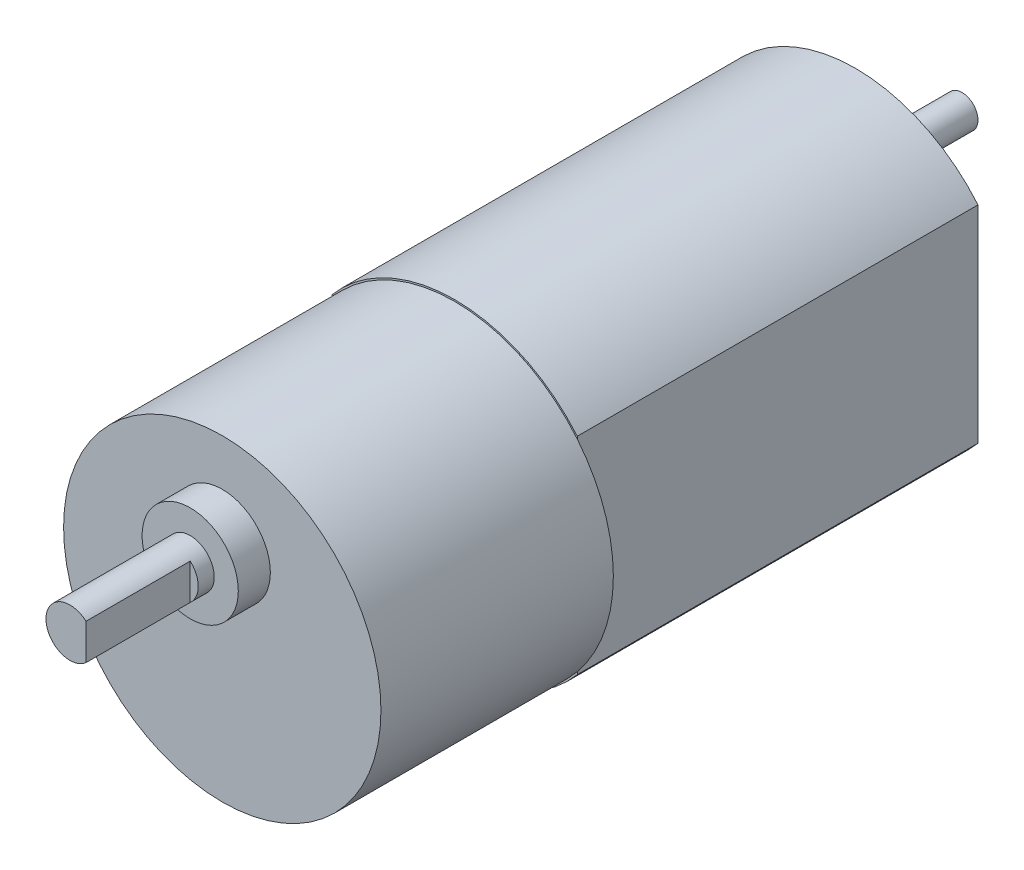
ISO-10303-21;
HEADER;
FILE_DESCRIPTION(('STEP AP214'),'2;1');
FILE_NAME('part.step','',(''),(''),'','','');
FILE_SCHEMA(('AUTOMOTIVE_DESIGN { 1 0 10303 214 1 1 1 1 }'));
ENDSEC;
DATA;
#1=APPLICATION_CONTEXT('core data for automotive mechanical design processes');
#2=APPLICATION_PROTOCOL_DEFINITION('international standard','automotive_design',2000,#1);
#3=PRODUCT_CONTEXT('',#1,'mechanical');
#4=PRODUCT('Part','Part','',(#3));
#5=PRODUCT_RELATED_PRODUCT_CATEGORY('part','',(#4));
#6=PRODUCT_DEFINITION_FORMATION('','',#4);
#7=PRODUCT_DEFINITION_CONTEXT('part definition',#1,'design');
#8=PRODUCT_DEFINITION('design','',#6,#7);
#9=PRODUCT_DEFINITION_SHAPE('','',#8);
#10=(LENGTH_UNIT() NAMED_UNIT(*) SI_UNIT(.MILLI.,.METRE.));
#11=(NAMED_UNIT(*) PLANE_ANGLE_UNIT() SI_UNIT($,.RADIAN.));
#12=(NAMED_UNIT(*) SI_UNIT($,.STERADIAN.) SOLID_ANGLE_UNIT());
#13=UNCERTAINTY_MEASURE_WITH_UNIT(LENGTH_MEASURE(1.E-05),#10,'distance_accuracy_value','');
#14=(GEOMETRIC_REPRESENTATION_CONTEXT(3) GLOBAL_UNCERTAINTY_ASSIGNED_CONTEXT((#13)) GLOBAL_UNIT_ASSIGNED_CONTEXT((#10,
#11,#12)) REPRESENTATION_CONTEXT('',''));
#15=CARTESIAN_POINT('',(0.,0.,0.));
#16=DIRECTION('',(0.,0.,1.));
#17=DIRECTION('',(1.,0.,0.));
#18=AXIS2_PLACEMENT_3D('',#15,#16,#17);
#19=CARTESIAN_POINT('',(0.,4.,41.5));
#20=DIRECTION('',(0.,0.,1.));
#21=DIRECTION('',(1.,0.,0.));
#22=AXIS2_PLACEMENT_3D('',#19,#20,#21);
#23=PLANE('',#22);
#24=CARTESIAN_POINT('',(0.,4.,41.5));
#25=DIRECTION('',(0.,0.,1.));
#26=DIRECTION('',(1.,0.,0.));
#27=AXIS2_PLACEMENT_3D('',#24,#25,#26);
#28=CIRCLE('',#27,3.);
#29=CARTESIAN_POINT('',(3.,4.,41.5));
#30=VERTEX_POINT('',#29);
#31=EDGE_CURVE('E126',#30,#30,#28,.T.);
#32=ORIENTED_EDGE('',*,*,#31,.T.);
#33=EDGE_LOOP('',(#32));
#34=FACE_BOUND('',#33,.T.);
#35=CARTESIAN_POINT('',(0.,4.,41.5));
#36=DIRECTION('',(0.,0.,1.));
#37=DIRECTION('',(1.,0.,0.));
#38=AXIS2_PLACEMENT_3D('',#35,#36,#37);
#39=CIRCLE('',#38,1.5);
#40=CARTESIAN_POINT('',(1.5,4.,41.5));
#41=VERTEX_POINT('',#40);
#42=EDGE_CURVE('E118',#41,#41,#39,.T.);
#43=ORIENTED_EDGE('',*,*,#42,.F.);
#44=EDGE_LOOP('',(#43));
#45=FACE_BOUND('',#44,.T.);
#46=ADVANCED_FACE('F38',(#34,#45),#23,.T.);
#47=CARTESIAN_POINT('',(0.,0.,39.5));
#48=DIRECTION('',(0.,0.,1.));
#49=DIRECTION('',(1.,0.,0.));
#50=AXIS2_PLACEMENT_3D('',#47,#48,#49);
#51=PLANE('',#50);
#52=CARTESIAN_POINT('',(0.,0.,39.5));
#53=DIRECTION('',(0.,0.,1.));
#54=DIRECTION('',(1.,0.,0.));
#55=AXIS2_PLACEMENT_3D('',#52,#53,#54);
#56=CIRCLE('',#55,9.9);
#57=CARTESIAN_POINT('',(9.9,0.,39.5));
#58=VERTEX_POINT('',#57);
#59=EDGE_CURVE('E147',#58,#58,#56,.T.);
#60=ORIENTED_EDGE('',*,*,#59,.T.);
#61=EDGE_LOOP('',(#60));
#62=FACE_BOUND('',#61,.T.);
#63=CARTESIAN_POINT('',(0.,4.,39.5));
#64=DIRECTION('',(0.,0.,1.));
#65=DIRECTION('',(1.,0.,0.));
#66=AXIS2_PLACEMENT_3D('',#63,#64,#65);
#67=CIRCLE('',#66,3.);
#68=CARTESIAN_POINT('',(3.,4.,39.5));
#69=VERTEX_POINT('',#68);
#70=EDGE_CURVE('E124',#69,#69,#67,.T.);
#71=ORIENTED_EDGE('',*,*,#70,.F.);
#72=EDGE_LOOP('',(#71));
#73=FACE_BOUND('',#72,.T.);
#74=ADVANCED_FACE('F200',(#62,#73),#51,.T.);
#75=CARTESIAN_POINT('',(0.,0.,0.));
#76=DIRECTION('',(0.,0.,1.));
#77=DIRECTION('',(1.,0.,0.));
#78=AXIS2_PLACEMENT_3D('',#75,#76,#77);
#79=PLANE('',#78);
#80=CARTESIAN_POINT('',(2.65,7.01623118205208,0.));
#81=DIRECTION('',(0.,0.,1.));
#82=DIRECTION('',(1.,0.,0.));
#83=AXIS2_PLACEMENT_3D('',#80,#81,#82);
#84=CIRCLE('',#83,1.);
#85=CARTESIAN_POINT('',(3.65,7.01623118205208,0.));
#86=VERTEX_POINT('',#85);
#87=EDGE_CURVE('E190',#86,#86,#84,.F.);
#88=ORIENTED_EDGE('',*,*,#87,.F.);
#89=EDGE_LOOP('',(#88));
#90=FACE_BOUND('',#89,.T.);
#91=CARTESIAN_POINT('',(0.,0.,0.));
#92=DIRECTION('',(0.,0.,1.));
#93=DIRECTION('',(1.,0.,0.));
#94=AXIS2_PLACEMENT_3D('',#91,#92,#93);
#95=CIRCLE('',#94,10.);
#96=CARTESIAN_POINT('',(7.65,6.440302787913,0.));
#97=VERTEX_POINT('',#96);
#98=CARTESIAN_POINT('',(-7.65,6.440302787913,0.));
#99=VERTEX_POINT('',#98);
#100=EDGE_CURVE('E150',#97,#99,#95,.T.);
#101=ORIENTED_EDGE('',*,*,#100,.F.);
#102=DIRECTION('',(0.,1.,0.));
#103=VECTOR('',#102,1.);
#104=CARTESIAN_POINT('',(7.65,-6.440302787913,0.));
#105=LINE('',#104,#103);
#106=CARTESIAN_POINT('',(7.65,-6.440302787913,0.));
#107=VERTEX_POINT('',#106);
#108=EDGE_CURVE('E158',#107,#97,#105,.T.);
#109=ORIENTED_EDGE('',*,*,#108,.F.);
#110=CARTESIAN_POINT('',(0.,0.,0.));
#111=DIRECTION('',(0.,0.,1.));
#112=DIRECTION('',(1.,0.,0.));
#113=AXIS2_PLACEMENT_3D('',#110,#111,#112);
#114=CIRCLE('',#113,10.);
#115=CARTESIAN_POINT('',(-7.65,-6.440302787913,0.));
#116=VERTEX_POINT('',#115);
#117=EDGE_CURVE('E173',#116,#107,#114,.T.);
#118=ORIENTED_EDGE('',*,*,#117,.F.);
#119=DIRECTION('',(0.,-1.,0.));
#120=VECTOR('',#119,1.);
#121=CARTESIAN_POINT('',(-7.65,6.440302787913,0.));
#122=LINE('',#121,#120);
#123=EDGE_CURVE('E171',#99,#116,#122,.T.);
#124=ORIENTED_EDGE('',*,*,#123,.F.);
#125=EDGE_LOOP('',(#101,#109,#118,#124));
#126=FACE_BOUND('',#125,.T.);
#127=CARTESIAN_POINT('',(0.,0.,0.));
#128=DIRECTION('',(0.,0.,1.));
#129=DIRECTION('',(1.,0.,0.));
#130=AXIS2_PLACEMENT_3D('',#127,#128,#129);
#131=CIRCLE('',#130,3.);
#132=CARTESIAN_POINT('',(3.,0.,0.));
#133=VERTEX_POINT('',#132);
#134=EDGE_CURVE('E187',#133,#133,#131,.F.);
#135=ORIENTED_EDGE('',*,*,#134,.F.);
#136=EDGE_LOOP('',(#135));
#137=FACE_BOUND('',#136,.T.);
#138=CARTESIAN_POINT('',(-2.65,-7.01623118205208,0.));
#139=DIRECTION('',(0.,0.,1.));
#140=DIRECTION('',(1.,0.,0.));
#141=AXIS2_PLACEMENT_3D('',#138,#139,#140);
#142=CIRCLE('',#141,1.);
#143=CARTESIAN_POINT('',(-1.65,-7.01623118205208,0.));
#144=VERTEX_POINT('',#143);
#145=EDGE_CURVE('E46',#144,#144,#142,.F.);
#146=ORIENTED_EDGE('',*,*,#145,.F.);
#147=EDGE_LOOP('',(#146));
#148=FACE_BOUND('',#147,.T.);
#149=ADVANCED_FACE('F197',(#90,#126,#137,#148),#79,.F.);
#150=CARTESIAN_POINT('',(0.,0.,-2.5));
#151=DIRECTION('',(0.,0.,-1.));
#152=DIRECTION('',(-1.,0.,0.));
#153=AXIS2_PLACEMENT_3D('',#150,#151,#152);
#154=PLANE('',#153);
#155=CARTESIAN_POINT('',(0.,0.,-2.5));
#156=DIRECTION('',(0.,0.,-1.));
#157=DIRECTION('',(-1.,0.,0.));
#158=AXIS2_PLACEMENT_3D('',#155,#156,#157);
#159=CIRCLE('',#158,3.);
#160=CARTESIAN_POINT('',(-3.,0.,-2.5));
#161=VERTEX_POINT('',#160);
#162=EDGE_CURVE('E141',#161,#161,#159,.T.);
#163=ORIENTED_EDGE('',*,*,#162,.T.);
#164=EDGE_LOOP('',(#163));
#165=FACE_BOUND('',#164,.T.);
#166=CARTESIAN_POINT('',(0.,0.,-2.5));
#167=DIRECTION('',(0.,0.,-1.));
#168=DIRECTION('',(-1.,0.,0.));
#169=AXIS2_PLACEMENT_3D('',#166,#167,#168);
#170=CIRCLE('',#169,1.);
#171=CARTESIAN_POINT('',(-1.,0.,-2.5));
#172=VERTEX_POINT('',#171);
#173=EDGE_CURVE('E137',#172,#172,#170,.T.);
#174=ORIENTED_EDGE('',*,*,#173,.F.);
#175=EDGE_LOOP('',(#174));
#176=FACE_BOUND('',#175,.T.);
#177=ADVANCED_FACE('F199',(#165,#176),#154,.T.);
#178=CARTESIAN_POINT('',(0.,0.,25.));
#179=DIRECTION('',(0.,0.,1.));
#180=DIRECTION('',(1.,0.,0.));
#181=AXIS2_PLACEMENT_3D('',#178,#179,#180);
#182=PLANE('',#181);
#183=CARTESIAN_POINT('',(0.,0.,25.));
#184=DIRECTION('',(0.,0.,1.));
#185=DIRECTION('',(1.,0.,0.));
#186=AXIS2_PLACEMENT_3D('',#183,#184,#185);
#187=CIRCLE('',#186,9.9);
#188=CARTESIAN_POINT('',(7.65,6.28390801969602,25.));
#189=VERTEX_POINT('',#188);
#190=CARTESIAN_POINT('',(-7.65,6.28390801969602,25.));
#191=VERTEX_POINT('',#190);
#192=EDGE_CURVE('E61',#189,#191,#187,.T.);
#193=ORIENTED_EDGE('',*,*,#192,.F.);
#194=DIRECTION('',(0.,1.,0.));
#195=VECTOR('',#194,1.);
#196=CARTESIAN_POINT('',(7.65,-6.440302787913,25.));
#197=LINE('',#196,#195);
#198=CARTESIAN_POINT('',(7.65,6.440302787913,25.));
#199=VERTEX_POINT('',#198);
#200=EDGE_CURVE('E164',#189,#199,#197,.T.);
#201=ORIENTED_EDGE('',*,*,#200,.T.);
#202=CARTESIAN_POINT('',(0.,0.,25.));
#203=DIRECTION('',(0.,0.,1.));
#204=DIRECTION('',(1.,0.,0.));
#205=AXIS2_PLACEMENT_3D('',#202,#203,#204);
#206=CIRCLE('',#205,10.);
#207=CARTESIAN_POINT('',(-7.65,6.440302787913,25.));
#208=VERTEX_POINT('',#207);
#209=EDGE_CURVE('E154',#199,#208,#206,.T.);
#210=ORIENTED_EDGE('',*,*,#209,.T.);
#211=DIRECTION('',(0.,-1.,0.));
#212=VECTOR('',#211,1.);
#213=CARTESIAN_POINT('',(-7.65,6.440302787913,25.));
#214=LINE('',#213,#212);
#215=EDGE_CURVE('E159',#208,#191,#214,.T.);
#216=ORIENTED_EDGE('',*,*,#215,.T.);
#217=EDGE_LOOP('',(#193,#201,#210,#216));
#218=FACE_BOUND('',#217,.T.);
#219=ADVANCED_FACE('F207',(#218),#182,.T.);
#220=CARTESIAN_POINT('',(0.,0.,25.));
#221=DIRECTION('',(0.,0.,-1.));
#222=DIRECTION('',(-1.,0.,0.));
#223=AXIS2_PLACEMENT_3D('',#220,#221,#222);
#224=CYLINDRICAL_SURFACE('',#223,10.);
#225=ORIENTED_EDGE('',*,*,#100,.T.);
#226=DIRECTION('',(0.,0.,-1.));
#227=VECTOR('',#226,1.);
#228=CARTESIAN_POINT('',(-7.65,6.440302787913,25.));
#229=LINE('',#228,#227);
#230=EDGE_CURVE('E184',#208,#99,#229,.T.);
#231=ORIENTED_EDGE('',*,*,#230,.F.);
#232=ORIENTED_EDGE('',*,*,#209,.F.);
#233=DIRECTION('',(0.,0.,-1.));
#234=VECTOR('',#233,1.);
#235=CARTESIAN_POINT('',(7.65,6.440302787913,25.));
#236=LINE('',#235,#234);
#237=EDGE_CURVE('E167',#199,#97,#236,.T.);
#238=ORIENTED_EDGE('',*,*,#237,.T.);
#239=EDGE_LOOP('',(#225,#231,#232,#238));
#240=FACE_BOUND('',#239,.T.);
#241=ADVANCED_FACE('F40',(#240),#224,.T.);
#242=CARTESIAN_POINT('',(-7.65,6.440302787913,25.));
#243=DIRECTION('',(1.,0.,0.));
#244=DIRECTION('',(0.,0.,-1.));
#245=AXIS2_PLACEMENT_3D('',#242,#243,#244);
#246=PLANE('',#245);
#247=ORIENTED_EDGE('',*,*,#123,.T.);
#248=DIRECTION('',(0.,0.,-1.));
#249=VECTOR('',#248,1.);
#250=CARTESIAN_POINT('',(-7.65,-6.440302787913,25.));
#251=LINE('',#250,#249);
#252=CARTESIAN_POINT('',(-7.65,-6.440302787913,25.));
#253=VERTEX_POINT('',#252);
#254=EDGE_CURVE('E181',#253,#116,#251,.T.);
#255=ORIENTED_EDGE('',*,*,#254,.F.);
#256=CARTESIAN_POINT('',(-7.65,-6.28390801969602,25.));
#257=VERTEX_POINT('',#256);
#258=EDGE_CURVE('E157',#257,#253,#214,.T.);
#259=ORIENTED_EDGE('',*,*,#258,.F.);
#260=EDGE_CURVE('E162',#191,#257,#214,.T.);
#261=ORIENTED_EDGE('',*,*,#260,.F.);
#262=ORIENTED_EDGE('',*,*,#215,.F.);
#263=ORIENTED_EDGE('',*,*,#230,.T.);
#264=EDGE_LOOP('',(#247,#255,#259,#261,#262,#263));
#265=FACE_BOUND('',#264,.T.);
#266=ADVANCED_FACE('F277',(#265),#246,.F.);
#267=CARTESIAN_POINT('',(0.,0.,25.));
#268=DIRECTION('',(0.,0.,-1.));
#269=DIRECTION('',(-1.,0.,0.));
#270=AXIS2_PLACEMENT_3D('',#267,#268,#269);
#271=CYLINDRICAL_SURFACE('',#270,10.);
#272=ORIENTED_EDGE('',*,*,#117,.T.);
#273=DIRECTION('',(0.,0.,-1.));
#274=VECTOR('',#273,1.);
#275=CARTESIAN_POINT('',(7.65,-6.440302787913,25.));
#276=LINE('',#275,#274);
#277=CARTESIAN_POINT('',(7.65,-6.440302787913,25.));
#278=VERTEX_POINT('',#277);
#279=EDGE_CURVE('E178',#278,#107,#276,.T.);
#280=ORIENTED_EDGE('',*,*,#279,.F.);
#281=CARTESIAN_POINT('',(0.,0.,25.));
#282=DIRECTION('',(0.,0.,1.));
#283=DIRECTION('',(1.,0.,0.));
#284=AXIS2_PLACEMENT_3D('',#281,#282,#283);
#285=CIRCLE('',#284,10.);
#286=EDGE_CURVE('E161',#253,#278,#285,.T.);
#287=ORIENTED_EDGE('',*,*,#286,.F.);
#288=ORIENTED_EDGE('',*,*,#254,.T.);
#289=EDGE_LOOP('',(#272,#280,#287,#288));
#290=FACE_BOUND('',#289,.T.);
#291=ADVANCED_FACE('F271',(#290),#271,.T.);
#292=CARTESIAN_POINT('',(7.65,-6.440302787913,25.));
#293=DIRECTION('',(-1.,0.,0.));
#294=DIRECTION('',(0.,0.,1.));
#295=AXIS2_PLACEMENT_3D('',#292,#293,#294);
#296=PLANE('',#295);
#297=ORIENTED_EDGE('',*,*,#108,.T.);
#298=ORIENTED_EDGE('',*,*,#237,.F.);
#299=ORIENTED_EDGE('',*,*,#200,.F.);
#300=CARTESIAN_POINT('',(7.65,-6.28390801969602,25.));
#301=VERTEX_POINT('',#300);
#302=EDGE_CURVE('E168',#301,#189,#197,.T.);
#303=ORIENTED_EDGE('',*,*,#302,.F.);
#304=EDGE_CURVE('E165',#278,#301,#197,.T.);
#305=ORIENTED_EDGE('',*,*,#304,.F.);
#306=ORIENTED_EDGE('',*,*,#279,.T.);
#307=EDGE_LOOP('',(#297,#298,#299,#303,#305,#306));
#308=FACE_BOUND('',#307,.T.);
#309=ADVANCED_FACE('F266',(#308),#296,.F.);
#310=EDGE_CURVE('E153',#257,#301,#187,.T.);
#311=ORIENTED_EDGE('',*,*,#310,.F.);
#312=ORIENTED_EDGE('',*,*,#258,.T.);
#313=ORIENTED_EDGE('',*,*,#286,.T.);
#314=ORIENTED_EDGE('',*,*,#304,.T.);
#315=EDGE_LOOP('',(#311,#312,#313,#314));
#316=FACE_BOUND('',#315,.T.);
#317=ADVANCED_FACE('F261',(#316),#182,.T.);
#318=CARTESIAN_POINT('',(0.,0.,25.));
#319=DIRECTION('',(0.,0.,1.));
#320=DIRECTION('',(1.,0.,0.));
#321=AXIS2_PLACEMENT_3D('',#318,#319,#320);
#322=PLANE('',#321);
#323=EDGE_CURVE('E152',#191,#257,#187,.T.);
#324=ORIENTED_EDGE('',*,*,#323,.F.);
#325=ORIENTED_EDGE('',*,*,#260,.T.);
#326=EDGE_LOOP('',(#324,#325));
#327=FACE_BOUND('',#326,.T.);
#328=ADVANCED_FACE('F257',(#327),#322,.F.);
#329=EDGE_CURVE('E146',#301,#189,#187,.T.);
#330=ORIENTED_EDGE('',*,*,#329,.F.);
#331=ORIENTED_EDGE('',*,*,#302,.T.);
#332=EDGE_LOOP('',(#330,#331));
#333=FACE_BOUND('',#332,.T.);
#334=ADVANCED_FACE('F260',(#333),#322,.F.);
#335=CARTESIAN_POINT('',(0.,0.,39.5));
#336=DIRECTION('',(0.,0.,-1.));
#337=DIRECTION('',(-1.,0.,0.));
#338=AXIS2_PLACEMENT_3D('',#335,#336,#337);
#339=CYLINDRICAL_SURFACE('',#338,9.9);
#340=ORIENTED_EDGE('',*,*,#59,.F.);
#341=EDGE_LOOP('',(#340));
#342=FACE_BOUND('',#341,.T.);
#343=ORIENTED_EDGE('',*,*,#192,.T.);
#344=ORIENTED_EDGE('',*,*,#323,.T.);
#345=ORIENTED_EDGE('',*,*,#310,.T.);
#346=ORIENTED_EDGE('',*,*,#329,.T.);
#347=EDGE_LOOP('',(#343,#344,#345,#346));
#348=FACE_BOUND('',#347,.T.);
#349=ADVANCED_FACE('F254',(#342,#348),#339,.T.);
#350=CARTESIAN_POINT('',(0.,0.,-2.5));
#351=DIRECTION('',(0.,0.,1.));
#352=DIRECTION('',(1.,0.,0.));
#353=AXIS2_PLACEMENT_3D('',#350,#351,#352);
#354=CYLINDRICAL_SURFACE('',#353,3.);
#355=ORIENTED_EDGE('',*,*,#162,.F.);
#356=EDGE_LOOP('',(#355));
#357=FACE_BOUND('',#356,.T.);
#358=ORIENTED_EDGE('',*,*,#134,.T.);
#359=EDGE_LOOP('',(#358));
#360=FACE_BOUND('',#359,.T.);
#361=ADVANCED_FACE('F250',(#357,#360),#354,.T.);
#362=CARTESIAN_POINT('',(0.,0.,-5.5));
#363=DIRECTION('',(0.,0.,1.));
#364=DIRECTION('',(1.,0.,0.));
#365=AXIS2_PLACEMENT_3D('',#362,#363,#364);
#366=CYLINDRICAL_SURFACE('',#365,1.);
#367=CARTESIAN_POINT('',(0.,0.,-5.5));
#368=DIRECTION('',(0.,0.,-1.));
#369=DIRECTION('',(-1.,0.,0.));
#370=AXIS2_PLACEMENT_3D('',#367,#368,#369);
#371=CIRCLE('',#370,1.);
#372=CARTESIAN_POINT('',(-1.,0.,-5.5));
#373=VERTEX_POINT('',#372);
#374=EDGE_CURVE('E138',#373,#373,#371,.T.);
#375=ORIENTED_EDGE('',*,*,#374,.F.);
#376=EDGE_LOOP('',(#375));
#377=FACE_BOUND('',#376,.T.);
#378=ORIENTED_EDGE('',*,*,#173,.T.);
#379=EDGE_LOOP('',(#378));
#380=FACE_BOUND('',#379,.T.);
#381=ADVANCED_FACE('F247',(#377,#380),#366,.T.);
#382=CARTESIAN_POINT('',(0.,0.,-5.5));
#383=DIRECTION('',(0.,0.,-1.));
#384=DIRECTION('',(-1.,0.,0.));
#385=AXIS2_PLACEMENT_3D('',#382,#383,#384);
#386=PLANE('',#385);
#387=ORIENTED_EDGE('',*,*,#374,.T.);
#388=EDGE_LOOP('',(#387));
#389=FACE_BOUND('',#388,.T.);
#390=ADVANCED_FACE('F243',(#389),#386,.T.);
#391=CARTESIAN_POINT('',(2.65,7.01623118205208,-4.));
#392=DIRECTION('',(0.,0.,1.));
#393=DIRECTION('',(1.,0.,0.));
#394=AXIS2_PLACEMENT_3D('',#391,#392,#393);
#395=CYLINDRICAL_SURFACE('',#394,1.);
#396=CARTESIAN_POINT('',(2.65,7.01623118205208,-4.));
#397=DIRECTION('',(0.,0.,-1.));
#398=DIRECTION('',(-1.,0.,0.));
#399=AXIS2_PLACEMENT_3D('',#396,#397,#398);
#400=CIRCLE('',#399,1.);
#401=CARTESIAN_POINT('',(1.65,7.01623118205208,-4.));
#402=VERTEX_POINT('',#401);
#403=EDGE_CURVE('E134',#402,#402,#400,.T.);
#404=ORIENTED_EDGE('',*,*,#403,.F.);
#405=EDGE_LOOP('',(#404));
#406=FACE_BOUND('',#405,.T.);
#407=ORIENTED_EDGE('',*,*,#87,.T.);
#408=EDGE_LOOP('',(#407));
#409=FACE_BOUND('',#408,.T.);
#410=ADVANCED_FACE('F239',(#406,#409),#395,.T.);
#411=CARTESIAN_POINT('',(2.65,7.01623118205208,-4.));
#412=DIRECTION('',(0.,0.,-1.));
#413=DIRECTION('',(-1.,0.,0.));
#414=AXIS2_PLACEMENT_3D('',#411,#412,#413);
#415=PLANE('',#414);
#416=ORIENTED_EDGE('',*,*,#403,.T.);
#417=EDGE_LOOP('',(#416));
#418=FACE_BOUND('',#417,.T.);
#419=ADVANCED_FACE('F235',(#418),#415,.T.);
#420=CARTESIAN_POINT('',(-2.65,-7.01623118205208,-4.));
#421=DIRECTION('',(0.,0.,1.));
#422=DIRECTION('',(1.,0.,0.));
#423=AXIS2_PLACEMENT_3D('',#420,#421,#422);
#424=CYLINDRICAL_SURFACE('',#423,1.);
#425=CARTESIAN_POINT('',(-2.65,-7.01623118205208,-4.));
#426=DIRECTION('',(0.,0.,-1.));
#427=DIRECTION('',(-1.,0.,0.));
#428=AXIS2_PLACEMENT_3D('',#425,#426,#427);
#429=CIRCLE('',#428,1.);
#430=CARTESIAN_POINT('',(-3.65,-7.01623118205208,-4.));
#431=VERTEX_POINT('',#430);
#432=EDGE_CURVE('E129',#431,#431,#429,.T.);
#433=ORIENTED_EDGE('',*,*,#432,.F.);
#434=EDGE_LOOP('',(#433));
#435=FACE_BOUND('',#434,.T.);
#436=ORIENTED_EDGE('',*,*,#145,.T.);
#437=EDGE_LOOP('',(#436));
#438=FACE_BOUND('',#437,.T.);
#439=ADVANCED_FACE('F195',(#435,#438),#424,.T.);
#440=CARTESIAN_POINT('',(-2.65,-7.01623118205208,-4.));
#441=DIRECTION('',(0.,0.,-1.));
#442=DIRECTION('',(-1.,0.,0.));
#443=AXIS2_PLACEMENT_3D('',#440,#441,#442);
#444=PLANE('',#443);
#445=ORIENTED_EDGE('',*,*,#432,.T.);
#446=EDGE_LOOP('',(#445));
#447=FACE_BOUND('',#446,.T.);
#448=ADVANCED_FACE('F228',(#447),#444,.T.);
#449=CARTESIAN_POINT('',(0.,4.,41.5));
#450=DIRECTION('',(0.,0.,-1.));
#451=DIRECTION('',(-1.,0.,0.));
#452=AXIS2_PLACEMENT_3D('',#449,#450,#451);
#453=CYLINDRICAL_SURFACE('',#452,3.);
#454=ORIENTED_EDGE('',*,*,#31,.F.);
#455=EDGE_LOOP('',(#454));
#456=FACE_BOUND('',#455,.T.);
#457=ORIENTED_EDGE('',*,*,#70,.T.);
#458=EDGE_LOOP('',(#457));
#459=FACE_BOUND('',#458,.T.);
#460=ADVANCED_FACE('F225',(#456,#459),#453,.T.);
#461=CARTESIAN_POINT('',(0.,4.,49.));
#462=DIRECTION('',(0.,0.,-1.));
#463=DIRECTION('',(-1.,0.,0.));
#464=AXIS2_PLACEMENT_3D('',#461,#462,#463);
#465=CYLINDRICAL_SURFACE('',#464,1.5);
#466=CARTESIAN_POINT('',(0.,4.,49.));
#467=DIRECTION('',(0.,0.,1.));
#468=DIRECTION('',(1.,0.,0.));
#469=AXIS2_PLACEMENT_3D('',#466,#467,#468);
#470=CIRCLE('',#469,1.5);
#471=CARTESIAN_POINT('',(1.,5.11803398874989,49.));
#472=VERTEX_POINT('',#471);
#473=CARTESIAN_POINT('',(1.,2.88196601125011,49.));
#474=VERTEX_POINT('',#473);
#475=EDGE_CURVE('E117',#472,#474,#470,.T.);
#476=ORIENTED_EDGE('',*,*,#475,.F.);
#477=DIRECTION('',(0.,0.,1.));
#478=VECTOR('',#477,1.);
#479=CARTESIAN_POINT('',(1.,5.11803398874989,42.5));
#480=LINE('',#479,#478);
#481=CARTESIAN_POINT('',(1.,5.11803398874989,42.5));
#482=VERTEX_POINT('',#481);
#483=EDGE_CURVE('E53',#482,#472,#480,.T.);
#484=ORIENTED_EDGE('',*,*,#483,.F.);
#485=CARTESIAN_POINT('',(0.,4.,42.5));
#486=DIRECTION('',(0.,0.,1.));
#487=DIRECTION('',(1.,0.,0.));
#488=AXIS2_PLACEMENT_3D('',#485,#486,#487);
#489=CIRCLE('',#488,1.5);
#490=CARTESIAN_POINT('',(1.,2.88196601125011,42.5));
#491=VERTEX_POINT('',#490);
#492=EDGE_CURVE('E11',#491,#482,#489,.T.);
#493=ORIENTED_EDGE('',*,*,#492,.F.);
#494=DIRECTION('',(0.,0.,1.));
#495=VECTOR('',#494,1.);
#496=CARTESIAN_POINT('',(1.,2.88196601125011,42.5));
#497=LINE('',#496,#495);
#498=EDGE_CURVE('E102',#491,#474,#497,.T.);
#499=ORIENTED_EDGE('',*,*,#498,.T.);
#500=EDGE_LOOP('',(#476,#484,#493,#499));
#501=FACE_BOUND('',#500,.T.);
#502=ORIENTED_EDGE('',*,*,#42,.T.);
#503=EDGE_LOOP('',(#502));
#504=FACE_BOUND('',#503,.T.);
#505=ADVANCED_FACE('F115',(#501,#504),#465,.T.);
#506=CARTESIAN_POINT('',(0.,4.,49.));
#507=DIRECTION('',(0.,0.,1.));
#508=DIRECTION('',(1.,0.,0.));
#509=AXIS2_PLACEMENT_3D('',#506,#507,#508);
#510=PLANE('',#509);
#511=DIRECTION('',(0.,-1.,0.));
#512=VECTOR('',#511,1.);
#513=CARTESIAN_POINT('',(1.,5.11803398874989,49.));
#514=LINE('',#513,#512);
#515=EDGE_CURVE('E106',#472,#474,#514,.T.);
#516=ORIENTED_EDGE('',*,*,#515,.F.);
#517=ORIENTED_EDGE('',*,*,#475,.T.);
#518=EDGE_LOOP('',(#516,#517));
#519=FACE_BOUND('',#518,.T.);
#520=ADVANCED_FACE('F356',(#519),#510,.T.);
#521=CARTESIAN_POINT('',(1.,2.88196601125011,42.5));
#522=DIRECTION('',(0.,0.,1.));
#523=DIRECTION('',(1.,0.,0.));
#524=AXIS2_PLACEMENT_3D('',#521,#522,#523);
#525=PLANE('',#524);
#526=ORIENTED_EDGE('',*,*,#492,.T.);
#527=DIRECTION('',(0.,-1.,0.));
#528=VECTOR('',#527,1.);
#529=CARTESIAN_POINT('',(1.,5.11803398874989,42.5));
#530=LINE('',#529,#528);
#531=EDGE_CURVE('E105',#482,#491,#530,.T.);
#532=ORIENTED_EDGE('',*,*,#531,.T.);
#533=EDGE_LOOP('',(#526,#532));
#534=FACE_BOUND('',#533,.T.);
#535=ADVANCED_FACE('F113',(#534),#525,.T.);
#536=CARTESIAN_POINT('',(1.,5.11803398874989,42.5));
#537=DIRECTION('',(-1.,0.,0.));
#538=DIRECTION('',(0.,-1.,0.));
#539=AXIS2_PLACEMENT_3D('',#536,#537,#538);
#540=PLANE('',#539);
#541=ORIENTED_EDGE('',*,*,#515,.T.);
#542=ORIENTED_EDGE('',*,*,#498,.F.);
#543=ORIENTED_EDGE('',*,*,#531,.F.);
#544=ORIENTED_EDGE('',*,*,#483,.T.);
#545=EDGE_LOOP('',(#541,#542,#543,#544));
#546=FACE_BOUND('',#545,.T.);
#547=ADVANCED_FACE('F104',(#546),#540,.F.);
#548=CLOSED_SHELL('',(#46,#74,#149,#177,#219,#241,#266,#291,#309,#317,#328,#334,#349,#361,#381,
#390,#410,#419,#439,#448,#460,#505,#520,#535,#547));
#549=MANIFOLD_SOLID_BREP('B2',#548);
#550=ADVANCED_BREP_SHAPE_REPRESENTATION('',(#18,#549),#14);
#551=SHAPE_DEFINITION_REPRESENTATION(#9,#550);
ENDSEC;
END-ISO-10303-21;
